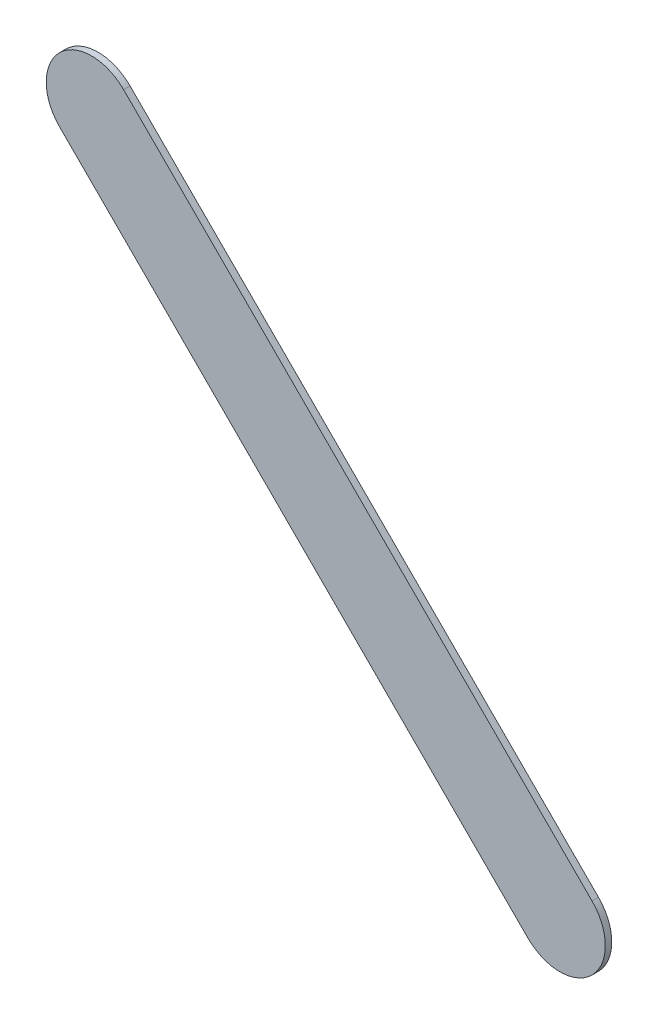
ISO-10303-21;
HEADER;
FILE_DESCRIPTION(('STEP AP214'),'2;1');
FILE_NAME('part.step','',(''),(''),'','','');
FILE_SCHEMA(('AUTOMOTIVE_DESIGN { 1 0 10303 214 1 1 1 1 }'));
ENDSEC;
DATA;
#1=APPLICATION_CONTEXT('core data for automotive mechanical design processes');
#2=APPLICATION_PROTOCOL_DEFINITION('international standard','automotive_design',2000,#1);
#3=PRODUCT_CONTEXT('',#1,'mechanical');
#4=PRODUCT('Part','Part','',(#3));
#5=PRODUCT_RELATED_PRODUCT_CATEGORY('part','',(#4));
#6=PRODUCT_DEFINITION_FORMATION('','',#4);
#7=PRODUCT_DEFINITION_CONTEXT('part definition',#1,'design');
#8=PRODUCT_DEFINITION('design','',#6,#7);
#9=PRODUCT_DEFINITION_SHAPE('','',#8);
#10=(LENGTH_UNIT() NAMED_UNIT(*) SI_UNIT(.MILLI.,.METRE.));
#11=(NAMED_UNIT(*) PLANE_ANGLE_UNIT() SI_UNIT($,.RADIAN.));
#12=(NAMED_UNIT(*) SI_UNIT($,.STERADIAN.) SOLID_ANGLE_UNIT());
#13=UNCERTAINTY_MEASURE_WITH_UNIT(LENGTH_MEASURE(1.E-05),#10,'distance_accuracy_value','');
#14=(GEOMETRIC_REPRESENTATION_CONTEXT(3) GLOBAL_UNCERTAINTY_ASSIGNED_CONTEXT((#13)) GLOBAL_UNIT_ASSIGNED_CONTEXT((#10,
#11,#12)) REPRESENTATION_CONTEXT('',''));
#15=CARTESIAN_POINT('',(0.,0.,0.));
#16=DIRECTION('',(0.,0.,1.));
#17=DIRECTION('',(1.,0.,0.));
#18=AXIS2_PLACEMENT_3D('',#15,#16,#17);
#19=CARTESIAN_POINT('',(101.1412125,105.40523496,0.));
#20=DIRECTION('',(0.707106781186548,0.707106781186548,0.));
#21=DIRECTION('',(0.707106781186548,-0.707106781186548,0.));
#22=AXIS2_PLACEMENT_3D('',#19,#20,#21);
#23=PLANE('',#22);
#24=DIRECTION('',(0.707106781186548,-0.707106781186548,0.));
#25=VECTOR('',#24,1.);
#26=CARTESIAN_POINT('',(101.1412125,105.40523496,0.03556));
#27=LINE('',#26,#25);
#28=CARTESIAN_POINT('',(101.1412125,105.40523496,0.03556));
#29=VERTEX_POINT('',#28);
#30=CARTESIAN_POINT('',(103.7232241,102.82322336,0.03556));
#31=VERTEX_POINT('',#30);
#32=EDGE_CURVE('E11',#29,#31,#27,.T.);
#33=ORIENTED_EDGE('',*,*,#32,.F.);
#34=DIRECTION('',(0.,0.,1.));
#35=VECTOR('',#34,1.);
#36=CARTESIAN_POINT('',(101.1412125,105.40523496,0.));
#37=LINE('',#36,#35);
#38=CARTESIAN_POINT('',(101.1412125,105.40523496,0.));
#39=VERTEX_POINT('',#38);
#40=EDGE_CURVE('E24',#39,#29,#37,.T.);
#41=ORIENTED_EDGE('',*,*,#40,.F.);
#42=DIRECTION('',(0.707106781186548,-0.707106781186548,0.));
#43=VECTOR('',#42,1.);
#44=CARTESIAN_POINT('',(101.1412125,105.40523496,0.));
#45=LINE('',#44,#43);
#46=CARTESIAN_POINT('',(103.7232241,102.82322336,0.));
#47=VERTEX_POINT('',#46);
#48=EDGE_CURVE('E75',#39,#47,#45,.T.);
#49=ORIENTED_EDGE('',*,*,#48,.T.);
#50=DIRECTION('',(0.,0.,1.));
#51=VECTOR('',#50,1.);
#52=CARTESIAN_POINT('',(103.7232241,102.82322336,0.));
#53=LINE('',#52,#51);
#54=EDGE_CURVE('E37',#47,#31,#53,.T.);
#55=ORIENTED_EDGE('',*,*,#54,.T.);
#56=EDGE_LOOP('',(#33,#41,#49,#55));
#57=FACE_BOUND('',#56,.T.);
#58=ADVANCED_FACE('F17',(#57),#23,.F.);
#59=CARTESIAN_POINT('',(103.90000048,102.99999974,0.));
#60=DIRECTION('',(0.,0.,-1.));
#61=DIRECTION('',(-0.707106781186519,-0.707106781186576,0.));
#62=AXIS2_PLACEMENT_3D('',#59,#60,#61);
#63=CYLINDRICAL_SURFACE('',#62,0.249999554103226);
#64=CARTESIAN_POINT('',(103.90000048,102.99999974,0.03556));
#65=DIRECTION('',(0.,0.,1.));
#66=DIRECTION('',(-0.707106781186519,-0.707106781186576,0.));
#67=AXIS2_PLACEMENT_3D('',#64,#65,#66);
#68=CIRCLE('',#67,0.249999554103226);
#69=CARTESIAN_POINT('',(104.07677686,103.17677612,0.03556));
#70=VERTEX_POINT('',#69);
#71=EDGE_CURVE('E83',#31,#70,#68,.T.);
#72=ORIENTED_EDGE('',*,*,#71,.F.);
#73=ORIENTED_EDGE('',*,*,#54,.F.);
#74=CARTESIAN_POINT('',(103.90000048,102.99999974,0.));
#75=DIRECTION('',(0.,0.,1.));
#76=DIRECTION('',(-0.707106781186519,-0.707106781186576,0.));
#77=AXIS2_PLACEMENT_3D('',#74,#75,#76);
#78=CIRCLE('',#77,0.249999554103226);
#79=CARTESIAN_POINT('',(104.07677686,103.17677612,0.));
#80=VERTEX_POINT('',#79);
#81=EDGE_CURVE('E81',#47,#80,#78,.T.);
#82=ORIENTED_EDGE('',*,*,#81,.T.);
#83=DIRECTION('',(0.,0.,1.));
#84=VECTOR('',#83,1.);
#85=CARTESIAN_POINT('',(104.07677686,103.17677612,0.));
#86=LINE('',#85,#84);
#87=EDGE_CURVE('E67',#80,#70,#86,.T.);
#88=ORIENTED_EDGE('',*,*,#87,.T.);
#89=EDGE_LOOP('',(#72,#73,#82,#88));
#90=FACE_BOUND('',#89,.T.);
#91=ADVANCED_FACE('F89',(#90),#63,.T.);
#92=CARTESIAN_POINT('',(104.07677686,103.17677612,0.));
#93=DIRECTION('',(-0.707106781186548,-0.707106781186548,0.));
#94=DIRECTION('',(-0.707106781186548,0.707106781186548,0.));
#95=AXIS2_PLACEMENT_3D('',#92,#93,#94);
#96=PLANE('',#95);
#97=DIRECTION('',(-0.707106781186548,0.707106781186548,0.));
#98=VECTOR('',#97,1.);
#99=CARTESIAN_POINT('',(104.07677686,103.17677612,0.03556));
#100=LINE('',#99,#98);
#101=CARTESIAN_POINT('',(101.49476526,105.75878772,0.03556));
#102=VERTEX_POINT('',#101);
#103=EDGE_CURVE('E71',#70,#102,#100,.T.);
#104=ORIENTED_EDGE('',*,*,#103,.F.);
#105=ORIENTED_EDGE('',*,*,#87,.F.);
#106=DIRECTION('',(-0.707106781186548,0.707106781186548,0.));
#107=VECTOR('',#106,1.);
#108=CARTESIAN_POINT('',(104.07677686,103.17677612,0.));
#109=LINE('',#108,#107);
#110=CARTESIAN_POINT('',(101.49476526,105.75878772,0.));
#111=VERTEX_POINT('',#110);
#112=EDGE_CURVE('E63',#80,#111,#109,.T.);
#113=ORIENTED_EDGE('',*,*,#112,.T.);
#114=DIRECTION('',(0.,0.,1.));
#115=VECTOR('',#114,1.);
#116=CARTESIAN_POINT('',(101.49476526,105.75878772,0.));
#117=LINE('',#116,#115);
#118=EDGE_CURVE('E53',#111,#102,#117,.T.);
#119=ORIENTED_EDGE('',*,*,#118,.T.);
#120=EDGE_LOOP('',(#104,#105,#113,#119));
#121=FACE_BOUND('',#120,.T.);
#122=ADVANCED_FACE('F66',(#121),#96,.F.);
#123=CARTESIAN_POINT('',(101.31798888,105.58201134,0.));
#124=DIRECTION('',(0.,0.,-1.));
#125=DIRECTION('',(0.707106781186519,0.707106781186576,0.));
#126=AXIS2_PLACEMENT_3D('',#123,#124,#125);
#127=CYLINDRICAL_SURFACE('',#126,0.249999554103226);
#128=CARTESIAN_POINT('',(101.31798888,105.58201134,0.03556));
#129=DIRECTION('',(0.,0.,1.));
#130=DIRECTION('',(0.707106781186519,0.707106781186576,0.));
#131=AXIS2_PLACEMENT_3D('',#128,#129,#130);
#132=CIRCLE('',#131,0.249999554103226);
#133=EDGE_CURVE('E59',#102,#29,#132,.T.);
#134=ORIENTED_EDGE('',*,*,#133,.F.);
#135=ORIENTED_EDGE('',*,*,#118,.F.);
#136=CARTESIAN_POINT('',(101.31798888,105.58201134,0.));
#137=DIRECTION('',(0.,0.,1.));
#138=DIRECTION('',(0.707106781186519,0.707106781186576,0.));
#139=AXIS2_PLACEMENT_3D('',#136,#137,#138);
#140=CIRCLE('',#139,0.249999554103226);
#141=EDGE_CURVE('E57',#111,#39,#140,.T.);
#142=ORIENTED_EDGE('',*,*,#141,.T.);
#143=ORIENTED_EDGE('',*,*,#40,.T.);
#144=EDGE_LOOP('',(#134,#135,#142,#143));
#145=FACE_BOUND('',#144,.T.);
#146=ADVANCED_FACE('F55',(#145),#127,.T.);
#147=CARTESIAN_POINT('',(101.1412125,105.40523496,0.));
#148=DIRECTION('',(0.,0.,-1.));
#149=DIRECTION('',(-1.,0.,0.));
#150=AXIS2_PLACEMENT_3D('',#147,#148,#149);
#151=PLANE('',#150);
#152=ORIENTED_EDGE('',*,*,#141,.F.);
#153=ORIENTED_EDGE('',*,*,#112,.F.);
#154=ORIENTED_EDGE('',*,*,#81,.F.);
#155=ORIENTED_EDGE('',*,*,#48,.F.);
#156=EDGE_LOOP('',(#152,#153,#154,#155));
#157=FACE_BOUND('',#156,.T.);
#158=ADVANCED_FACE('F74',(#157),#151,.T.);
#159=CARTESIAN_POINT('',(101.1412125,105.40523496,0.03556));
#160=DIRECTION('',(0.,0.,-1.));
#161=DIRECTION('',(-1.,0.,0.));
#162=AXIS2_PLACEMENT_3D('',#159,#160,#161);
#163=PLANE('',#162);
#164=ORIENTED_EDGE('',*,*,#32,.T.);
#165=ORIENTED_EDGE('',*,*,#71,.T.);
#166=ORIENTED_EDGE('',*,*,#103,.T.);
#167=ORIENTED_EDGE('',*,*,#133,.T.);
#168=EDGE_LOOP('',(#164,#165,#166,#167));
#169=FACE_BOUND('',#168,.T.);
#170=ADVANCED_FACE('F91',(#169),#163,.F.);
#171=CLOSED_SHELL('',(#58,#91,#122,#146,#158,#170));
#172=MANIFOLD_SOLID_BREP('B1',#171);
#173=ADVANCED_BREP_SHAPE_REPRESENTATION('',(#18,#172),#14);
#174=SHAPE_DEFINITION_REPRESENTATION(#9,#173);
ENDSEC;
END-ISO-10303-21;
